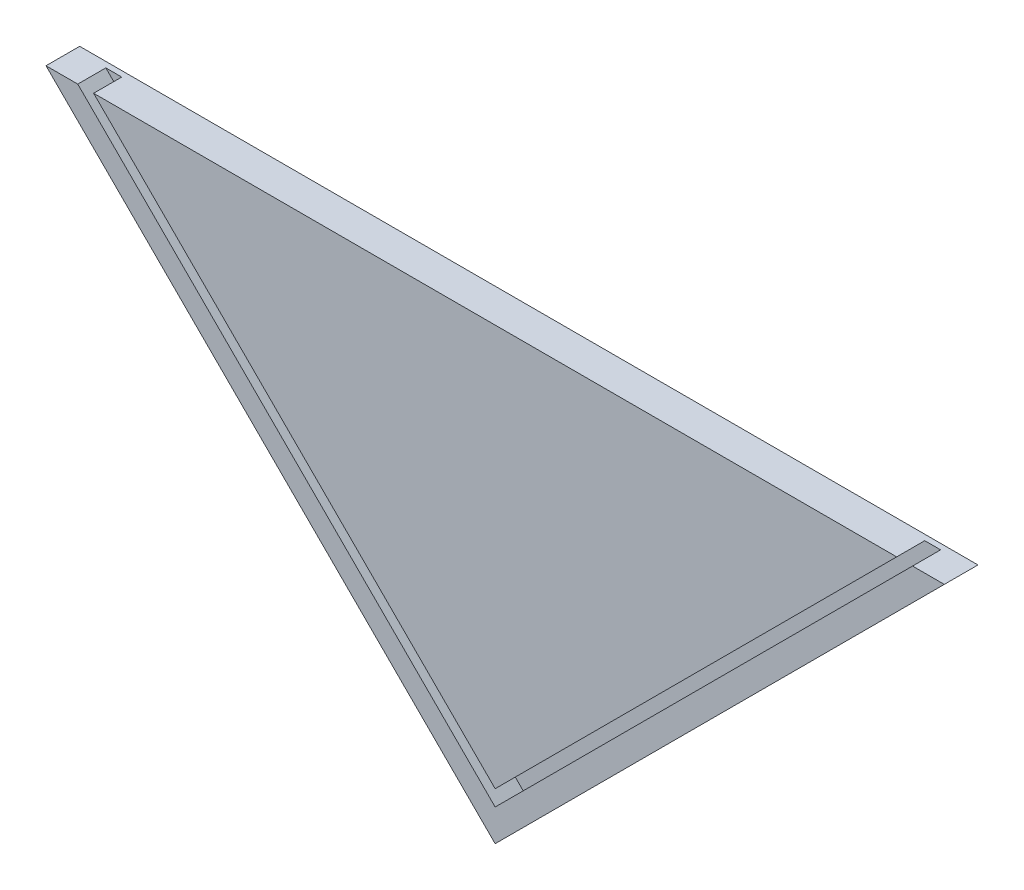
ISO-10303-21;
HEADER;
FILE_DESCRIPTION(('STEP AP214'),'2;1');
FILE_NAME('part.step','',(''),(''),'','','');
FILE_SCHEMA(('AUTOMOTIVE_DESIGN { 1 0 10303 214 1 1 1 1 }'));
ENDSEC;
DATA;
#1=APPLICATION_CONTEXT('core data for automotive mechanical design processes');
#2=APPLICATION_PROTOCOL_DEFINITION('international standard','automotive_design',2000,#1);
#3=PRODUCT_CONTEXT('',#1,'mechanical');
#4=PRODUCT('Part','Part','',(#3));
#5=PRODUCT_RELATED_PRODUCT_CATEGORY('part','',(#4));
#6=PRODUCT_DEFINITION_FORMATION('','',#4);
#7=PRODUCT_DEFINITION_CONTEXT('part definition',#1,'design');
#8=PRODUCT_DEFINITION('design','',#6,#7);
#9=PRODUCT_DEFINITION_SHAPE('','',#8);
#10=(LENGTH_UNIT() NAMED_UNIT(*) SI_UNIT(.MILLI.,.METRE.));
#11=(NAMED_UNIT(*) PLANE_ANGLE_UNIT() SI_UNIT($,.RADIAN.));
#12=(NAMED_UNIT(*) SI_UNIT($,.STERADIAN.) SOLID_ANGLE_UNIT());
#13=UNCERTAINTY_MEASURE_WITH_UNIT(LENGTH_MEASURE(1.E-05),#10,'distance_accuracy_value','');
#14=(GEOMETRIC_REPRESENTATION_CONTEXT(3) GLOBAL_UNCERTAINTY_ASSIGNED_CONTEXT((#13)) GLOBAL_UNIT_ASSIGNED_CONTEXT((#10,
#11,#12)) REPRESENTATION_CONTEXT('',''));
#15=CARTESIAN_POINT('',(0.,0.,0.));
#16=DIRECTION('',(0.,0.,1.));
#17=DIRECTION('',(1.,0.,0.));
#18=AXIS2_PLACEMENT_3D('',#15,#16,#17);
#19=CARTESIAN_POINT('',(0.,0.,3.));
#20=DIRECTION('',(0.,0.,-1.));
#21=DIRECTION('',(-1.,0.,0.));
#22=AXIS2_PLACEMENT_3D('',#19,#20,#21);
#23=PLANE('',#22);
#24=DIRECTION('',(-1.,0.,0.));
#25=VECTOR('',#24,1.);
#26=CARTESIAN_POINT('',(39.9999999999999,40.,3.));
#27=LINE('',#26,#25);
#28=CARTESIAN_POINT('',(39.9999999999999,40.,3.));
#29=VERTEX_POINT('',#28);
#30=CARTESIAN_POINT('',(37.1715728752536,40.,3.));
#31=VERTEX_POINT('',#30);
#32=EDGE_CURVE('E87',#29,#31,#27,.T.);
#33=ORIENTED_EDGE('',*,*,#32,.T.);
#34=DIRECTION('',(0.707106781186547,0.707106781186548,0.));
#35=VECTOR('',#34,1.);
#36=CARTESIAN_POINT('',(37.1715728752536,40.,3.));
#37=LINE('',#36,#35);
#38=CARTESIAN_POINT('',(0.,2.82842712474633,3.));
#39=VERTEX_POINT('',#38);
#40=EDGE_CURVE('E127',#39,#31,#37,.T.);
#41=ORIENTED_EDGE('',*,*,#40,.F.);
#42=DIRECTION('',(0.707106781186548,-0.707106781186547,0.));
#43=VECTOR('',#42,1.);
#44=CARTESIAN_POINT('',(0.,2.82842712474633,3.));
#45=LINE('',#44,#43);
#46=CARTESIAN_POINT('',(-37.1715728752537,40.,3.));
#47=VERTEX_POINT('',#46);
#48=EDGE_CURVE('E139',#47,#39,#45,.T.);
#49=ORIENTED_EDGE('',*,*,#48,.F.);
#50=CARTESIAN_POINT('',(-39.9999999999999,40.,3.));
#51=VERTEX_POINT('',#50);
#52=EDGE_CURVE('E189',#47,#51,#27,.T.);
#53=ORIENTED_EDGE('',*,*,#52,.T.);
#54=DIRECTION('',(0.707106781186546,-0.707106781186549,0.));
#55=VECTOR('',#54,1.);
#56=CARTESIAN_POINT('',(-39.9999999999999,40.,3.));
#57=LINE('',#56,#55);
#58=CARTESIAN_POINT('',(0.,0.,3.));
#59=VERTEX_POINT('',#58);
#60=EDGE_CURVE('E64',#51,#59,#57,.T.);
#61=ORIENTED_EDGE('',*,*,#60,.T.);
#62=DIRECTION('',(0.707106781186546,0.707106781186549,0.));
#63=VECTOR('',#62,1.);
#64=CARTESIAN_POINT('',(0.,0.,3.));
#65=LINE('',#64,#63);
#66=EDGE_CURVE('E186',#59,#29,#65,.T.);
#67=ORIENTED_EDGE('',*,*,#66,.T.);
#68=EDGE_LOOP('',(#33,#41,#49,#53,#61,#67));
#69=FACE_BOUND('',#68,.T.);
#70=ADVANCED_FACE('F39',(#69),#23,.F.);
#71=CARTESIAN_POINT('',(0.,0.,3.));
#72=DIRECTION('',(-0.707106781186549,0.707106781186546,0.));
#73=DIRECTION('',(-0.707106781186546,-0.707106781186549,0.));
#74=AXIS2_PLACEMENT_3D('',#71,#72,#73);
#75=PLANE('',#74);
#76=DIRECTION('',(0.707106781186546,0.707106781186549,0.));
#77=VECTOR('',#76,1.);
#78=CARTESIAN_POINT('',(0.,0.,0.));
#79=LINE('',#78,#77);
#80=CARTESIAN_POINT('',(0.,0.,0.));
#81=VERTEX_POINT('',#80);
#82=CARTESIAN_POINT('',(39.9999999999999,40.,0.));
#83=VERTEX_POINT('',#82);
#84=EDGE_CURVE('E173',#81,#83,#79,.T.);
#85=ORIENTED_EDGE('',*,*,#84,.T.);
#86=DIRECTION('',(0.,0.,-1.));
#87=VECTOR('',#86,1.);
#88=CARTESIAN_POINT('',(39.9999999999999,40.,3.));
#89=LINE('',#88,#87);
#90=EDGE_CURVE('E11',#29,#83,#89,.T.);
#91=ORIENTED_EDGE('',*,*,#90,.F.);
#92=ORIENTED_EDGE('',*,*,#66,.F.);
#93=DIRECTION('',(0.,0.,-1.));
#94=VECTOR('',#93,1.);
#95=CARTESIAN_POINT('',(0.,0.,3.));
#96=LINE('',#95,#94);
#97=EDGE_CURVE('E195',#59,#81,#96,.T.);
#98=ORIENTED_EDGE('',*,*,#97,.T.);
#99=EDGE_LOOP('',(#85,#91,#92,#98));
#100=FACE_BOUND('',#99,.T.);
#101=ADVANCED_FACE('F41',(#100),#75,.F.);
#102=CARTESIAN_POINT('',(39.9999999999999,40.,3.));
#103=DIRECTION('',(0.,-1.,0.));
#104=DIRECTION('',(0.,0.,-1.));
#105=AXIS2_PLACEMENT_3D('',#102,#103,#104);
#106=PLANE('',#105);
#107=ORIENTED_EDGE('',*,*,#52,.F.);
#108=DIRECTION('',(0.,0.,1.));
#109=VECTOR('',#108,1.);
#110=CARTESIAN_POINT('',(-37.1715728752537,40.,0.5));
#111=LINE('',#110,#109);
#112=CARTESIAN_POINT('',(-37.1715728752537,40.,0.5));
#113=VERTEX_POINT('',#112);
#114=EDGE_CURVE('E174',#113,#47,#111,.T.);
#115=ORIENTED_EDGE('',*,*,#114,.F.);
#116=DIRECTION('',(-1.,0.,0.));
#117=VECTOR('',#116,1.);
#118=CARTESIAN_POINT('',(-37.1715728752537,40.,0.5));
#119=LINE('',#118,#117);
#120=CARTESIAN_POINT('',(-35.7573593128806,40.,0.5));
#121=VERTEX_POINT('',#120);
#122=EDGE_CURVE('E154',#121,#113,#119,.T.);
#123=ORIENTED_EDGE('',*,*,#122,.F.);
#124=DIRECTION('',(0.,0.,1.));
#125=VECTOR('',#124,1.);
#126=CARTESIAN_POINT('',(-35.7573593128806,40.,0.5));
#127=LINE('',#126,#125);
#128=CARTESIAN_POINT('',(-35.7573593128806,40.,3.));
#129=VERTEX_POINT('',#128);
#130=EDGE_CURVE('E177',#121,#129,#127,.T.);
#131=ORIENTED_EDGE('',*,*,#130,.T.);
#132=CARTESIAN_POINT('',(35.7573593128806,40.,3.));
#133=VERTEX_POINT('',#132);
#134=EDGE_CURVE('E192',#133,#129,#27,.T.);
#135=ORIENTED_EDGE('',*,*,#134,.F.);
#136=DIRECTION('',(0.,0.,1.));
#137=VECTOR('',#136,1.);
#138=CARTESIAN_POINT('',(35.7573593128806,40.,0.5));
#139=LINE('',#138,#137);
#140=CARTESIAN_POINT('',(35.7573593128806,40.,0.5));
#141=VERTEX_POINT('',#140);
#142=EDGE_CURVE('E55',#141,#133,#139,.T.);
#143=ORIENTED_EDGE('',*,*,#142,.F.);
#144=DIRECTION('',(-1.,0.,0.));
#145=VECTOR('',#144,1.);
#146=CARTESIAN_POINT('',(37.1715728752536,40.,0.5));
#147=LINE('',#146,#145);
#148=CARTESIAN_POINT('',(37.1715728752536,40.,0.5));
#149=VERTEX_POINT('',#148);
#150=EDGE_CURVE('E136',#149,#141,#147,.T.);
#151=ORIENTED_EDGE('',*,*,#150,.F.);
#152=DIRECTION('',(0.,0.,1.));
#153=VECTOR('',#152,1.);
#154=CARTESIAN_POINT('',(37.1715728752536,40.,0.5));
#155=LINE('',#154,#153);
#156=EDGE_CURVE('E121',#149,#31,#155,.T.);
#157=ORIENTED_EDGE('',*,*,#156,.T.);
#158=ORIENTED_EDGE('',*,*,#32,.F.);
#159=ORIENTED_EDGE('',*,*,#90,.T.);
#160=DIRECTION('',(-1.,0.,0.));
#161=VECTOR('',#160,1.);
#162=CARTESIAN_POINT('',(39.9999999999999,40.,0.));
#163=LINE('',#162,#161);
#164=CARTESIAN_POINT('',(-39.9999999999999,40.,0.));
#165=VERTEX_POINT('',#164);
#166=EDGE_CURVE('E199',#83,#165,#163,.T.);
#167=ORIENTED_EDGE('',*,*,#166,.T.);
#168=DIRECTION('',(0.,0.,-1.));
#169=VECTOR('',#168,1.);
#170=CARTESIAN_POINT('',(-39.9999999999999,40.,3.));
#171=LINE('',#170,#169);
#172=EDGE_CURVE('E48',#51,#165,#171,.T.);
#173=ORIENTED_EDGE('',*,*,#172,.F.);
#174=EDGE_LOOP('',(#107,#115,#123,#131,#135,#143,#151,#157,#158,#159,#167,#173));
#175=FACE_BOUND('',#174,.T.);
#176=ADVANCED_FACE('F142',(#175),#106,.F.);
#177=CARTESIAN_POINT('',(-39.9999999999999,40.,3.));
#178=DIRECTION('',(0.707106781186549,0.707106781186546,0.));
#179=DIRECTION('',(-0.707106781186546,0.707106781186549,0.));
#180=AXIS2_PLACEMENT_3D('',#177,#178,#179);
#181=PLANE('',#180);
#182=DIRECTION('',(0.707106781186546,-0.707106781186549,0.));
#183=VECTOR('',#182,1.);
#184=CARTESIAN_POINT('',(-39.9999999999999,40.,0.));
#185=LINE('',#184,#183);
#186=EDGE_CURVE('E81',#165,#81,#185,.T.);
#187=ORIENTED_EDGE('',*,*,#186,.T.);
#188=ORIENTED_EDGE('',*,*,#97,.F.);
#189=ORIENTED_EDGE('',*,*,#60,.F.);
#190=ORIENTED_EDGE('',*,*,#172,.T.);
#191=EDGE_LOOP('',(#187,#188,#189,#190));
#192=FACE_BOUND('',#191,.T.);
#193=ADVANCED_FACE('F207',(#192),#181,.F.);
#194=ORIENTED_EDGE('',*,*,#134,.T.);
#195=DIRECTION('',(-0.707106781186548,0.707106781186548,0.));
#196=VECTOR('',#195,1.);
#197=CARTESIAN_POINT('',(0.,4.24264068711942,3.));
#198=LINE('',#197,#196);
#199=CARTESIAN_POINT('',(0.,4.24264068711942,3.));
#200=VERTEX_POINT('',#199);
#201=EDGE_CURVE('E164',#200,#129,#198,.T.);
#202=ORIENTED_EDGE('',*,*,#201,.F.);
#203=DIRECTION('',(-0.707106781186547,-0.707106781186548,0.));
#204=VECTOR('',#203,1.);
#205=CARTESIAN_POINT('',(35.7573593128806,40.,3.));
#206=LINE('',#205,#204);
#207=EDGE_CURVE('E161',#133,#200,#206,.T.);
#208=ORIENTED_EDGE('',*,*,#207,.F.);
#209=EDGE_LOOP('',(#194,#202,#208));
#210=FACE_BOUND('',#209,.T.);
#211=ADVANCED_FACE('F223',(#210),#23,.F.);
#212=CARTESIAN_POINT('',(0.,0.,0.));
#213=DIRECTION('',(0.,0.,-1.));
#214=DIRECTION('',(-1.,0.,0.));
#215=AXIS2_PLACEMENT_3D('',#212,#213,#214);
#216=PLANE('',#215);
#217=ORIENTED_EDGE('',*,*,#84,.F.);
#218=ORIENTED_EDGE('',*,*,#186,.F.);
#219=ORIENTED_EDGE('',*,*,#166,.F.);
#220=EDGE_LOOP('',(#217,#218,#219));
#221=FACE_BOUND('',#220,.T.);
#222=ADVANCED_FACE('F210',(#221),#216,.T.);
#223=CARTESIAN_POINT('',(37.1715728752536,40.,0.5));
#224=DIRECTION('',(0.707106781186548,-0.707106781186547,0.));
#225=DIRECTION('',(0.707106781186547,0.707106781186548,0.));
#226=AXIS2_PLACEMENT_3D('',#223,#224,#225);
#227=PLANE('',#226);
#228=ORIENTED_EDGE('',*,*,#40,.T.);
#229=ORIENTED_EDGE('',*,*,#156,.F.);
#230=DIRECTION('',(0.707106781186547,0.707106781186548,0.));
#231=VECTOR('',#230,1.);
#232=CARTESIAN_POINT('',(37.1715728752536,40.,0.5));
#233=LINE('',#232,#231);
#234=CARTESIAN_POINT('',(0.,2.82842712474633,0.5));
#235=VERTEX_POINT('',#234);
#236=EDGE_CURVE('E124',#235,#149,#233,.T.);
#237=ORIENTED_EDGE('',*,*,#236,.F.);
#238=DIRECTION('',(0.,0.,1.));
#239=VECTOR('',#238,1.);
#240=CARTESIAN_POINT('',(0.,2.82842712474633,0.5));
#241=LINE('',#240,#239);
#242=EDGE_CURVE('E170',#235,#39,#241,.T.);
#243=ORIENTED_EDGE('',*,*,#242,.T.);
#244=EDGE_LOOP('',(#228,#229,#237,#243));
#245=FACE_BOUND('',#244,.T.);
#246=ADVANCED_FACE('F123',(#245),#227,.F.);
#247=CARTESIAN_POINT('',(0.,2.82842712474633,0.5));
#248=DIRECTION('',(-0.707106781186547,-0.707106781186548,0.));
#249=DIRECTION('',(0.707106781186548,-0.707106781186547,0.));
#250=AXIS2_PLACEMENT_3D('',#247,#248,#249);
#251=PLANE('',#250);
#252=ORIENTED_EDGE('',*,*,#48,.T.);
#253=ORIENTED_EDGE('',*,*,#242,.F.);
#254=DIRECTION('',(0.707106781186548,-0.707106781186547,0.));
#255=VECTOR('',#254,1.);
#256=CARTESIAN_POINT('',(0.,2.82842712474633,0.5));
#257=LINE('',#256,#255);
#258=EDGE_CURVE('E130',#113,#235,#257,.T.);
#259=ORIENTED_EDGE('',*,*,#258,.F.);
#260=ORIENTED_EDGE('',*,*,#114,.T.);
#261=EDGE_LOOP('',(#252,#253,#259,#260));
#262=FACE_BOUND('',#261,.T.);
#263=ADVANCED_FACE('F235',(#262),#251,.F.);
#264=CARTESIAN_POINT('',(0.,4.24264068711942,0.5));
#265=DIRECTION('',(0.707106781186548,0.707106781186548,0.));
#266=DIRECTION('',(-0.707106781186548,0.707106781186548,0.));
#267=AXIS2_PLACEMENT_3D('',#264,#265,#266);
#268=PLANE('',#267);
#269=ORIENTED_EDGE('',*,*,#201,.T.);
#270=ORIENTED_EDGE('',*,*,#130,.F.);
#271=DIRECTION('',(-0.707106781186548,0.707106781186548,0.));
#272=VECTOR('',#271,1.);
#273=CARTESIAN_POINT('',(0.,4.24264068711942,0.5));
#274=LINE('',#273,#272);
#275=CARTESIAN_POINT('',(0.,4.24264068711942,0.5));
#276=VERTEX_POINT('',#275);
#277=EDGE_CURVE('E148',#276,#121,#274,.T.);
#278=ORIENTED_EDGE('',*,*,#277,.F.);
#279=DIRECTION('',(0.,0.,1.));
#280=VECTOR('',#279,1.);
#281=CARTESIAN_POINT('',(0.,4.24264068711942,0.5));
#282=LINE('',#281,#280);
#283=EDGE_CURVE('E181',#276,#200,#282,.T.);
#284=ORIENTED_EDGE('',*,*,#283,.T.);
#285=EDGE_LOOP('',(#269,#270,#278,#284));
#286=FACE_BOUND('',#285,.T.);
#287=ADVANCED_FACE('F226',(#286),#268,.F.);
#288=CARTESIAN_POINT('',(35.7573593128806,40.,0.5));
#289=DIRECTION('',(-0.707106781186548,0.707106781186547,0.));
#290=DIRECTION('',(-0.707106781186547,-0.707106781186548,0.));
#291=AXIS2_PLACEMENT_3D('',#288,#289,#290);
#292=PLANE('',#291);
#293=ORIENTED_EDGE('',*,*,#207,.T.);
#294=ORIENTED_EDGE('',*,*,#283,.F.);
#295=DIRECTION('',(-0.707106781186547,-0.707106781186548,0.));
#296=VECTOR('',#295,1.);
#297=CARTESIAN_POINT('',(35.7573593128806,40.,0.5));
#298=LINE('',#297,#296);
#299=EDGE_CURVE('E145',#141,#276,#298,.T.);
#300=ORIENTED_EDGE('',*,*,#299,.F.);
#301=ORIENTED_EDGE('',*,*,#142,.T.);
#302=EDGE_LOOP('',(#293,#294,#300,#301));
#303=FACE_BOUND('',#302,.T.);
#304=ADVANCED_FACE('F227',(#303),#292,.F.);
#305=CARTESIAN_POINT('',(0.,0.,0.5));
#306=DIRECTION('',(0.,0.,-1.));
#307=DIRECTION('',(-1.,0.,0.));
#308=AXIS2_PLACEMENT_3D('',#305,#306,#307);
#309=PLANE('',#308);
#310=ORIENTED_EDGE('',*,*,#236,.T.);
#311=ORIENTED_EDGE('',*,*,#150,.T.);
#312=ORIENTED_EDGE('',*,*,#299,.T.);
#313=ORIENTED_EDGE('',*,*,#277,.T.);
#314=ORIENTED_EDGE('',*,*,#122,.T.);
#315=ORIENTED_EDGE('',*,*,#258,.T.);
#316=EDGE_LOOP('',(#310,#311,#312,#313,#314,#315));
#317=FACE_BOUND('',#316,.T.);
#318=ADVANCED_FACE('F134',(#317),#309,.F.);
#319=CLOSED_SHELL('',(#70,#101,#176,#193,#211,#222,#246,#263,#287,#304,#318));
#320=MANIFOLD_SOLID_BREP('B2',#319);
#321=ADVANCED_BREP_SHAPE_REPRESENTATION('',(#18,#320),#14);
#322=SHAPE_DEFINITION_REPRESENTATION(#9,#321);
ENDSEC;
END-ISO-10303-21;
